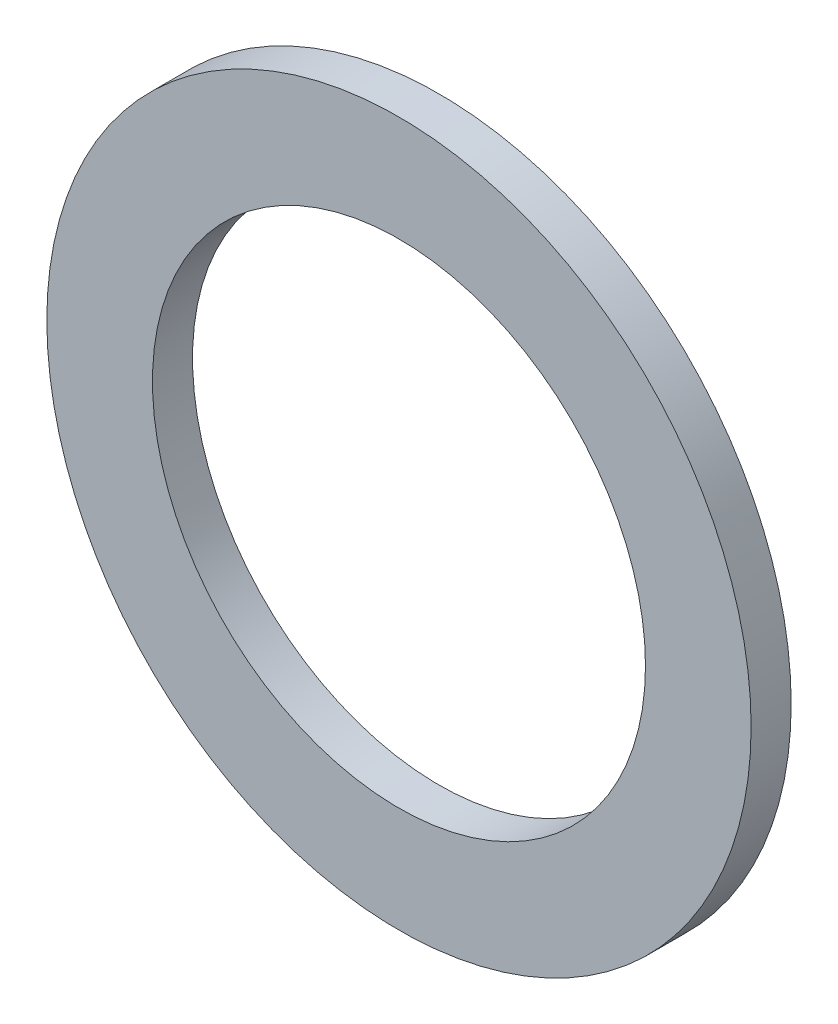
ISO-10303-21;
HEADER;
FILE_DESCRIPTION(('STEP AP214'),'2;1');
FILE_NAME('part.step','',(''),(''),'','','');
FILE_SCHEMA(('AUTOMOTIVE_DESIGN { 1 0 10303 214 1 1 1 1 }'));
ENDSEC;
DATA;
#1=APPLICATION_CONTEXT('core data for automotive mechanical design processes');
#2=APPLICATION_PROTOCOL_DEFINITION('international standard','automotive_design',2000,#1);
#3=PRODUCT_CONTEXT('',#1,'mechanical');
#4=PRODUCT('Part','Part','',(#3));
#5=PRODUCT_RELATED_PRODUCT_CATEGORY('part','',(#4));
#6=PRODUCT_DEFINITION_FORMATION('','',#4);
#7=PRODUCT_DEFINITION_CONTEXT('part definition',#1,'design');
#8=PRODUCT_DEFINITION('design','',#6,#7);
#9=PRODUCT_DEFINITION_SHAPE('','',#8);
#10=(LENGTH_UNIT() NAMED_UNIT(*) SI_UNIT(.MILLI.,.METRE.));
#11=(NAMED_UNIT(*) PLANE_ANGLE_UNIT() SI_UNIT($,.RADIAN.));
#12=(NAMED_UNIT(*) SI_UNIT($,.STERADIAN.) SOLID_ANGLE_UNIT());
#13=UNCERTAINTY_MEASURE_WITH_UNIT(LENGTH_MEASURE(1.E-05),#10,'distance_accuracy_value','');
#14=(GEOMETRIC_REPRESENTATION_CONTEXT(3) GLOBAL_UNCERTAINTY_ASSIGNED_CONTEXT((#13)) GLOBAL_UNIT_ASSIGNED_CONTEXT((#10,
#11,#12)) REPRESENTATION_CONTEXT('',''));
#15=CARTESIAN_POINT('',(0.,0.,0.));
#16=DIRECTION('',(0.,0.,1.));
#17=DIRECTION('',(1.,0.,0.));
#18=AXIS2_PLACEMENT_3D('',#15,#16,#17);
#19=CARTESIAN_POINT('',(23.993,16.8,0.568749942));
#20=DIRECTION('',(0.,0.,1.));
#21=DIRECTION('',(1.,0.,0.));
#22=AXIS2_PLACEMENT_3D('',#19,#20,#21);
#23=PLANE('',#22);
#24=CARTESIAN_POINT('',(23.993,16.8,0.568749942));
#25=DIRECTION('',(0.,0.,1.));
#26=DIRECTION('',(1.,0.,0.));
#27=AXIS2_PLACEMENT_3D('',#24,#25,#26);
#28=CIRCLE('',#27,10.);
#29=CARTESIAN_POINT('',(33.993,16.8,0.568749942));
#30=VERTEX_POINT('',#29);
#31=EDGE_CURVE('E10',#30,#30,#28,.T.);
#32=ORIENTED_EDGE('',*,*,#31,.T.);
#33=EDGE_LOOP('',(#32));
#34=FACE_BOUND('',#33,.T.);
#35=CARTESIAN_POINT('',(23.993,16.8,0.568749942));
#36=DIRECTION('',(0.,0.,1.));
#37=DIRECTION('',(1.,0.,0.));
#38=AXIS2_PLACEMENT_3D('',#35,#36,#37);
#39=CIRCLE('',#38,7.);
#40=CARTESIAN_POINT('',(30.993,16.8,0.568749942));
#41=VERTEX_POINT('',#40);
#42=EDGE_CURVE('E48',#41,#41,#39,.T.);
#43=ORIENTED_EDGE('',*,*,#42,.F.);
#44=EDGE_LOOP('',(#43));
#45=FACE_BOUND('',#44,.T.);
#46=ADVANCED_FACE('F37',(#34,#45),#23,.T.);
#47=CARTESIAN_POINT('',(23.993,16.8,-0.568749942));
#48=DIRECTION('',(0.,0.,1.));
#49=DIRECTION('',(1.,0.,0.));
#50=AXIS2_PLACEMENT_3D('',#47,#48,#49);
#51=PLANE('',#50);
#52=CARTESIAN_POINT('',(23.993,16.8,-0.568749942));
#53=DIRECTION('',(0.,0.,1.));
#54=DIRECTION('',(1.,0.,0.));
#55=AXIS2_PLACEMENT_3D('',#52,#53,#54);
#56=CIRCLE('',#55,10.);
#57=CARTESIAN_POINT('',(33.993,16.8,-0.568749942));
#58=VERTEX_POINT('',#57);
#59=EDGE_CURVE('E41',#58,#58,#56,.T.);
#60=ORIENTED_EDGE('',*,*,#59,.F.);
#61=EDGE_LOOP('',(#60));
#62=FACE_BOUND('',#61,.T.);
#63=CARTESIAN_POINT('',(23.993,16.8,-0.568749942));
#64=DIRECTION('',(0.,0.,1.));
#65=DIRECTION('',(1.,0.,0.));
#66=AXIS2_PLACEMENT_3D('',#63,#64,#65);
#67=CIRCLE('',#66,7.);
#68=CARTESIAN_POINT('',(30.993,16.8,-0.568749942));
#69=VERTEX_POINT('',#68);
#70=EDGE_CURVE('E50',#69,#69,#67,.T.);
#71=ORIENTED_EDGE('',*,*,#70,.T.);
#72=EDGE_LOOP('',(#71));
#73=FACE_BOUND('',#72,.T.);
#74=ADVANCED_FACE('F60',(#62,#73),#51,.F.);
#75=CARTESIAN_POINT('',(23.993,16.8,0.568749942));
#76=DIRECTION('',(0.,0.,-1.));
#77=DIRECTION('',(-1.,0.,0.));
#78=AXIS2_PLACEMENT_3D('',#75,#76,#77);
#79=CYLINDRICAL_SURFACE('',#78,10.);
#80=ORIENTED_EDGE('',*,*,#31,.F.);
#81=EDGE_LOOP('',(#80));
#82=FACE_BOUND('',#81,.T.);
#83=ORIENTED_EDGE('',*,*,#59,.T.);
#84=EDGE_LOOP('',(#83));
#85=FACE_BOUND('',#84,.T.);
#86=ADVANCED_FACE('F39',(#82,#85),#79,.T.);
#87=CARTESIAN_POINT('',(23.993,16.8,0.568749942));
#88=DIRECTION('',(0.,0.,-1.));
#89=DIRECTION('',(-1.,0.,0.));
#90=AXIS2_PLACEMENT_3D('',#87,#88,#89);
#91=CYLINDRICAL_SURFACE('',#90,7.);
#92=ORIENTED_EDGE('',*,*,#42,.T.);
#93=EDGE_LOOP('',(#92));
#94=FACE_BOUND('',#93,.T.);
#95=ORIENTED_EDGE('',*,*,#70,.F.);
#96=EDGE_LOOP('',(#95));
#97=FACE_BOUND('',#96,.T.);
#98=ADVANCED_FACE('F56',(#94,#97),#91,.F.);
#99=CLOSED_SHELL('',(#46,#74,#86,#98));
#100=MANIFOLD_SOLID_BREP('B2',#99);
#101=ADVANCED_BREP_SHAPE_REPRESENTATION('',(#18,#100),#14);
#102=SHAPE_DEFINITION_REPRESENTATION(#9,#101);
ENDSEC;
END-ISO-10303-21;
